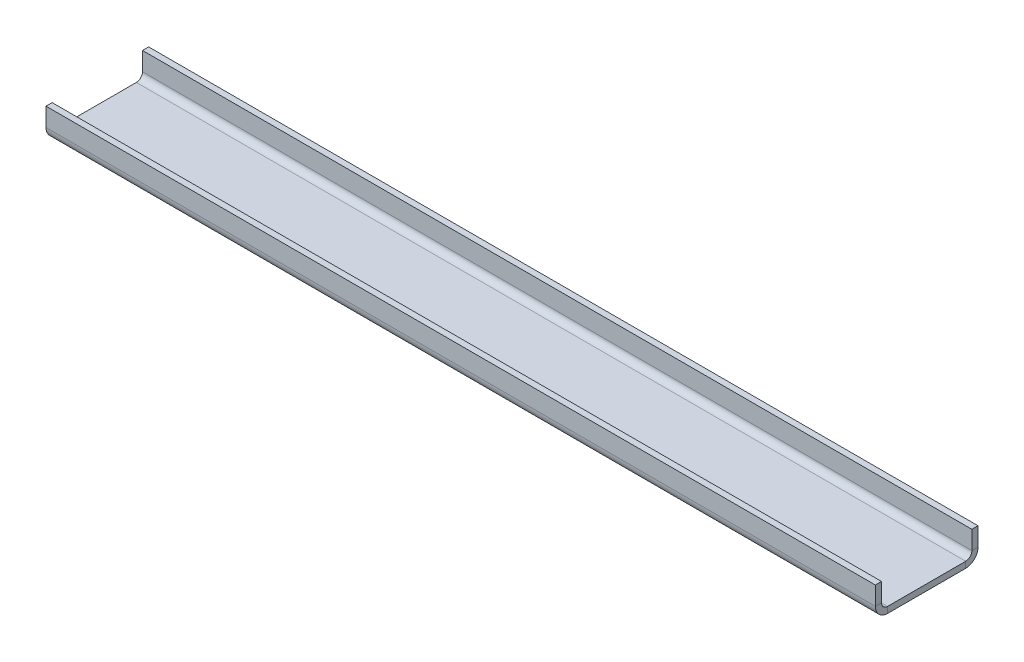
ISO-10303-21;
HEADER;
FILE_DESCRIPTION(('STEP AP214'),'2;1');
FILE_NAME('part.step','',(''),(''),'','','');
FILE_SCHEMA(('AUTOMOTIVE_DESIGN { 1 0 10303 214 1 1 1 1 }'));
ENDSEC;
DATA;
#1=APPLICATION_CONTEXT('core data for automotive mechanical design processes');
#2=APPLICATION_PROTOCOL_DEFINITION('international standard','automotive_design',2000,#1);
#3=PRODUCT_CONTEXT('',#1,'mechanical');
#4=PRODUCT('Part','Part','',(#3));
#5=PRODUCT_RELATED_PRODUCT_CATEGORY('part','',(#4));
#6=PRODUCT_DEFINITION_FORMATION('','',#4);
#7=PRODUCT_DEFINITION_CONTEXT('part definition',#1,'design');
#8=PRODUCT_DEFINITION('design','',#6,#7);
#9=PRODUCT_DEFINITION_SHAPE('','',#8);
#10=(LENGTH_UNIT() NAMED_UNIT(*) SI_UNIT(.MILLI.,.METRE.));
#11=(NAMED_UNIT(*) PLANE_ANGLE_UNIT() SI_UNIT($,.RADIAN.));
#12=(NAMED_UNIT(*) SI_UNIT($,.STERADIAN.) SOLID_ANGLE_UNIT());
#13=UNCERTAINTY_MEASURE_WITH_UNIT(LENGTH_MEASURE(1.E-05),#10,'distance_accuracy_value','');
#14=(GEOMETRIC_REPRESENTATION_CONTEXT(3) GLOBAL_UNCERTAINTY_ASSIGNED_CONTEXT((#13)) GLOBAL_UNIT_ASSIGNED_CONTEXT((#10,
#11,#12)) REPRESENTATION_CONTEXT('',''));
#15=CARTESIAN_POINT('',(0.,0.,0.));
#16=DIRECTION('',(0.,0.,1.));
#17=DIRECTION('',(1.,0.,0.));
#18=AXIS2_PLACEMENT_3D('',#15,#16,#17);
#19=CARTESIAN_POINT('',(0.,-3.,0.));
#20=DIRECTION('',(0.,-1.,0.));
#21=DIRECTION('',(0.,0.,-1.));
#22=AXIS2_PLACEMENT_3D('',#19,#20,#21);
#23=PLANE('',#22);
#24=DIRECTION('',(0.,0.,1.));
#25=VECTOR('',#24,1.);
#26=CARTESIAN_POINT('',(0.,-3.,0.));
#27=LINE('',#26,#25);
#28=CARTESIAN_POINT('',(0.,-3.00000000000001,-44.));
#29=VERTEX_POINT('',#28);
#30=CARTESIAN_POINT('',(0.,-3.,-6.));
#31=VERTEX_POINT('',#30);
#32=EDGE_CURVE('E84',#29,#31,#27,.T.);
#33=ORIENTED_EDGE('',*,*,#32,.F.);
#34=DIRECTION('',(-1.,0.,0.));
#35=VECTOR('',#34,1.);
#36=CARTESIAN_POINT('',(0.,-3.00000000000001,-44.));
#37=LINE('',#36,#35);
#38=CARTESIAN_POINT('',(404.,-3.,-44.));
#39=VERTEX_POINT('',#38);
#40=EDGE_CURVE('E207',#29,#39,#37,.F.);
#41=ORIENTED_EDGE('',*,*,#40,.T.);
#42=DIRECTION('',(0.,0.,-1.));
#43=VECTOR('',#42,1.);
#44=CARTESIAN_POINT('',(404.,-3.,0.));
#45=LINE('',#44,#43);
#46=CARTESIAN_POINT('',(404.,-3.00000000000001,-6.));
#47=VERTEX_POINT('',#46);
#48=EDGE_CURVE('E13',#47,#39,#45,.T.);
#49=ORIENTED_EDGE('',*,*,#48,.F.);
#50=DIRECTION('',(1.,0.,0.));
#51=VECTOR('',#50,1.);
#52=CARTESIAN_POINT('',(404.,-3.00000000000001,-6.));
#53=LINE('',#52,#51);
#54=EDGE_CURVE('E258',#47,#31,#53,.F.);
#55=ORIENTED_EDGE('',*,*,#54,.T.);
#56=EDGE_LOOP('',(#33,#41,#49,#55));
#57=FACE_BOUND('',#56,.T.);
#58=ADVANCED_FACE('F75',(#57),#23,.T.);
#59=CARTESIAN_POINT('',(0.,0.,0.));
#60=DIRECTION('',(0.,-1.,0.));
#61=DIRECTION('',(0.,0.,-1.));
#62=AXIS2_PLACEMENT_3D('',#59,#60,#61);
#63=PLANE('',#62);
#64=DIRECTION('',(-1.,0.,0.));
#65=VECTOR('',#64,1.);
#66=CARTESIAN_POINT('',(0.,0.,-44.));
#67=LINE('',#66,#65);
#68=CARTESIAN_POINT('',(0.,0.,-44.));
#69=VERTEX_POINT('',#68);
#70=CARTESIAN_POINT('',(404.,0.,-44.));
#71=VERTEX_POINT('',#70);
#72=EDGE_CURVE('E218',#69,#71,#67,.F.);
#73=ORIENTED_EDGE('',*,*,#72,.F.);
#74=DIRECTION('',(0.,0.,1.));
#75=VECTOR('',#74,1.);
#76=CARTESIAN_POINT('',(0.,0.,0.));
#77=LINE('',#76,#75);
#78=CARTESIAN_POINT('',(0.,0.,-6.));
#79=VERTEX_POINT('',#78);
#80=EDGE_CURVE('E275',#69,#79,#77,.T.);
#81=ORIENTED_EDGE('',*,*,#80,.T.);
#82=DIRECTION('',(1.,0.,0.));
#83=VECTOR('',#82,1.);
#84=CARTESIAN_POINT('',(404.,0.,-6.));
#85=LINE('',#84,#83);
#86=CARTESIAN_POINT('',(404.,0.,-6.));
#87=VERTEX_POINT('',#86);
#88=EDGE_CURVE('E269',#87,#79,#85,.F.);
#89=ORIENTED_EDGE('',*,*,#88,.F.);
#90=DIRECTION('',(0.,0.,-1.));
#91=VECTOR('',#90,1.);
#92=CARTESIAN_POINT('',(404.,0.,0.));
#93=LINE('',#92,#91);
#94=EDGE_CURVE('E79',#87,#71,#93,.T.);
#95=ORIENTED_EDGE('',*,*,#94,.T.);
#96=EDGE_LOOP('',(#73,#81,#89,#95));
#97=FACE_BOUND('',#96,.T.);
#98=ADVANCED_FACE('F287',(#97),#63,.F.);
#99=CARTESIAN_POINT('',(0.,-3.,0.));
#100=DIRECTION('',(-1.,0.,0.));
#101=DIRECTION('',(0.,0.,1.));
#102=AXIS2_PLACEMENT_3D('',#99,#100,#101);
#103=PLANE('',#102);
#104=ORIENTED_EDGE('',*,*,#80,.F.);
#105=DIRECTION('',(0.,-1.,0.));
#106=VECTOR('',#105,1.);
#107=CARTESIAN_POINT('',(0.,0.,-44.));
#108=LINE('',#107,#106);
#109=EDGE_CURVE('E212',#69,#29,#108,.T.);
#110=ORIENTED_EDGE('',*,*,#109,.T.);
#111=ORIENTED_EDGE('',*,*,#32,.T.);
#112=DIRECTION('',(0.,-1.,0.));
#113=VECTOR('',#112,1.);
#114=CARTESIAN_POINT('',(0.,0.,-6.));
#115=LINE('',#114,#113);
#116=EDGE_CURVE('E273',#79,#31,#115,.T.);
#117=ORIENTED_EDGE('',*,*,#116,.F.);
#118=EDGE_LOOP('',(#104,#110,#111,#117));
#119=FACE_BOUND('',#118,.T.);
#120=ADVANCED_FACE('F77',(#119),#103,.T.);
#121=CARTESIAN_POINT('',(404.,-3.,0.));
#122=DIRECTION('',(1.,0.,0.));
#123=DIRECTION('',(0.,0.,-1.));
#124=AXIS2_PLACEMENT_3D('',#121,#122,#123);
#125=PLANE('',#124);
#126=DIRECTION('',(0.,-1.,0.));
#127=VECTOR('',#126,1.);
#128=CARTESIAN_POINT('',(404.,0.,-44.));
#129=LINE('',#128,#127);
#130=EDGE_CURVE('E223',#71,#39,#129,.T.);
#131=ORIENTED_EDGE('',*,*,#130,.F.);
#132=ORIENTED_EDGE('',*,*,#94,.F.);
#133=DIRECTION('',(0.,-1.,0.));
#134=VECTOR('',#133,1.);
#135=CARTESIAN_POINT('',(404.,0.,-6.));
#136=LINE('',#135,#134);
#137=EDGE_CURVE('E263',#87,#47,#136,.T.);
#138=ORIENTED_EDGE('',*,*,#137,.T.);
#139=ORIENTED_EDGE('',*,*,#48,.T.);
#140=EDGE_LOOP('',(#131,#132,#138,#139));
#141=FACE_BOUND('',#140,.T.);
#142=ADVANCED_FACE('F290',(#141),#125,.T.);
#143=CARTESIAN_POINT('',(0.,2.99999999999999,-6.));
#144=DIRECTION('',(-1.,0.,0.));
#145=DIRECTION('',(0.,0.,1.));
#146=AXIS2_PLACEMENT_3D('',#143,#144,#145);
#147=PLANE('',#146);
#148=DIRECTION('',(0.,0.,-1.));
#149=VECTOR('',#148,1.);
#150=CARTESIAN_POINT('',(0.,2.99999999999999,0.));
#151=LINE('',#150,#149);
#152=CARTESIAN_POINT('',(0.,2.99999999999999,-3.));
#153=VERTEX_POINT('',#152);
#154=CARTESIAN_POINT('',(0.,2.99999999999999,0.));
#155=VERTEX_POINT('',#154);
#156=EDGE_CURVE('E225',#153,#155,#151,.F.);
#157=ORIENTED_EDGE('',*,*,#156,.F.);
#158=CARTESIAN_POINT('',(0.,2.99999999999999,-6.));
#159=DIRECTION('',(1.,0.,0.));
#160=DIRECTION('',(0.,0.,-1.));
#161=AXIS2_PLACEMENT_3D('',#158,#159,#160);
#162=CIRCLE('',#161,3.);
#163=EDGE_CURVE('E266',#79,#153,#162,.F.);
#164=ORIENTED_EDGE('',*,*,#163,.F.);
#165=ORIENTED_EDGE('',*,*,#116,.T.);
#166=CARTESIAN_POINT('',(0.,2.99999999999999,-6.));
#167=DIRECTION('',(1.,0.,0.));
#168=DIRECTION('',(0.,0.,-1.));
#169=AXIS2_PLACEMENT_3D('',#166,#167,#168);
#170=CIRCLE('',#169,6.);
#171=EDGE_CURVE('E92',#31,#155,#170,.F.);
#172=ORIENTED_EDGE('',*,*,#171,.T.);
#173=EDGE_LOOP('',(#157,#164,#165,#172));
#174=FACE_BOUND('',#173,.T.);
#175=ADVANCED_FACE('F305',(#174),#147,.T.);
#176=CARTESIAN_POINT('',(404.,2.99999999999999,-6.));
#177=DIRECTION('',(-1.,0.,0.));
#178=DIRECTION('',(0.,0.,1.));
#179=AXIS2_PLACEMENT_3D('',#176,#177,#178);
#180=PLANE('',#179);
#181=CARTESIAN_POINT('',(404.,2.99999999999999,-6.));
#182=DIRECTION('',(1.,0.,0.));
#183=DIRECTION('',(0.,0.,-1.));
#184=AXIS2_PLACEMENT_3D('',#181,#182,#183);
#185=CIRCLE('',#184,3.);
#186=CARTESIAN_POINT('',(404.,2.99999999999999,-3.));
#187=VERTEX_POINT('',#186);
#188=EDGE_CURVE('E231',#187,#87,#185,.T.);
#189=ORIENTED_EDGE('',*,*,#188,.F.);
#190=DIRECTION('',(0.,0.,-1.));
#191=VECTOR('',#190,1.);
#192=CARTESIAN_POINT('',(404.,2.99999999999999,-2.99999999999999));
#193=LINE('',#192,#191);
#194=CARTESIAN_POINT('',(404.,2.99999999999999,0.));
#195=VERTEX_POINT('',#194);
#196=EDGE_CURVE('E251',#187,#195,#193,.F.);
#197=ORIENTED_EDGE('',*,*,#196,.T.);
#198=CARTESIAN_POINT('',(404.,2.99999999999999,-6.));
#199=DIRECTION('',(1.,0.,0.));
#200=DIRECTION('',(0.,0.,-1.));
#201=AXIS2_PLACEMENT_3D('',#198,#199,#200);
#202=CIRCLE('',#201,6.);
#203=EDGE_CURVE('E261',#195,#47,#202,.T.);
#204=ORIENTED_EDGE('',*,*,#203,.T.);
#205=ORIENTED_EDGE('',*,*,#137,.F.);
#206=EDGE_LOOP('',(#189,#197,#204,#205));
#207=FACE_BOUND('',#206,.T.);
#208=ADVANCED_FACE('F329',(#207),#180,.F.);
#209=CARTESIAN_POINT('',(404.,2.99999999999999,-6.));
#210=DIRECTION('',(1.,0.,0.));
#211=DIRECTION('',(0.,0.,1.));
#212=AXIS2_PLACEMENT_3D('',#209,#210,#211);
#213=CYLINDRICAL_SURFACE('',#212,6.);
#214=ORIENTED_EDGE('',*,*,#54,.F.);
#215=ORIENTED_EDGE('',*,*,#203,.F.);
#216=DIRECTION('',(1.,0.,0.));
#217=VECTOR('',#216,1.);
#218=CARTESIAN_POINT('',(0.,2.99999999999999,0.));
#219=LINE('',#218,#217);
#220=EDGE_CURVE('E249',#195,#155,#219,.F.);
#221=ORIENTED_EDGE('',*,*,#220,.T.);
#222=ORIENTED_EDGE('',*,*,#171,.F.);
#223=EDGE_LOOP('',(#214,#215,#221,#222));
#224=FACE_BOUND('',#223,.T.);
#225=ADVANCED_FACE('F332',(#224),#213,.T.);
#226=CARTESIAN_POINT('',(404.,2.99999999999999,-6.));
#227=DIRECTION('',(1.,0.,0.));
#228=DIRECTION('',(0.,0.,1.));
#229=AXIS2_PLACEMENT_3D('',#226,#227,#228);
#230=CYLINDRICAL_SURFACE('',#229,3.);
#231=ORIENTED_EDGE('',*,*,#88,.T.);
#232=ORIENTED_EDGE('',*,*,#163,.T.);
#233=DIRECTION('',(1.,0.,0.));
#234=VECTOR('',#233,1.);
#235=CARTESIAN_POINT('',(0.,2.99999999999999,-3.));
#236=LINE('',#235,#234);
#237=EDGE_CURVE('E254',#153,#187,#236,.T.);
#238=ORIENTED_EDGE('',*,*,#237,.T.);
#239=ORIENTED_EDGE('',*,*,#188,.T.);
#240=EDGE_LOOP('',(#231,#232,#238,#239));
#241=FACE_BOUND('',#240,.T.);
#242=ADVANCED_FACE('F308',(#241),#230,.F.);
#243=CARTESIAN_POINT('',(0.,0.,0.));
#244=DIRECTION('',(1.,0.,0.));
#245=DIRECTION('',(0.,0.,-1.));
#246=AXIS2_PLACEMENT_3D('',#243,#244,#245);
#247=PLANE('',#246);
#248=ORIENTED_EDGE('',*,*,#156,.T.);
#249=DIRECTION('',(0.,-1.,0.));
#250=VECTOR('',#249,1.);
#251=CARTESIAN_POINT('',(0.,0.,0.));
#252=LINE('',#251,#250);
#253=CARTESIAN_POINT('',(0.,12.,0.));
#254=VERTEX_POINT('',#253);
#255=EDGE_CURVE('E239',#254,#155,#252,.T.);
#256=ORIENTED_EDGE('',*,*,#255,.F.);
#257=DIRECTION('',(0.,0.,-1.));
#258=VECTOR('',#257,1.);
#259=CARTESIAN_POINT('',(0.,12.,0.));
#260=LINE('',#259,#258);
#261=CARTESIAN_POINT('',(0.,12.,-3.));
#262=VERTEX_POINT('',#261);
#263=EDGE_CURVE('E232',#254,#262,#260,.T.);
#264=ORIENTED_EDGE('',*,*,#263,.T.);
#265=DIRECTION('',(0.,1.,0.));
#266=VECTOR('',#265,1.);
#267=CARTESIAN_POINT('',(0.,0.,-3.));
#268=LINE('',#267,#266);
#269=EDGE_CURVE('E246',#262,#153,#268,.F.);
#270=ORIENTED_EDGE('',*,*,#269,.T.);
#271=EDGE_LOOP('',(#248,#256,#264,#270));
#272=FACE_BOUND('',#271,.T.);
#273=ADVANCED_FACE('F316',(#272),#247,.F.);
#274=CARTESIAN_POINT('',(404.,12.,0.));
#275=DIRECTION('',(-1.,0.,0.));
#276=DIRECTION('',(0.,0.,1.));
#277=AXIS2_PLACEMENT_3D('',#274,#275,#276);
#278=PLANE('',#277);
#279=ORIENTED_EDGE('',*,*,#196,.F.);
#280=DIRECTION('',(0.,-1.,0.));
#281=VECTOR('',#280,1.);
#282=CARTESIAN_POINT('',(404.,12.,-3.));
#283=LINE('',#282,#281);
#284=CARTESIAN_POINT('',(404.,12.,-3.));
#285=VERTEX_POINT('',#284);
#286=EDGE_CURVE('E244',#187,#285,#283,.F.);
#287=ORIENTED_EDGE('',*,*,#286,.T.);
#288=DIRECTION('',(0.,0.,-1.));
#289=VECTOR('',#288,1.);
#290=CARTESIAN_POINT('',(404.,12.,0.));
#291=LINE('',#290,#289);
#292=CARTESIAN_POINT('',(404.,12.,0.));
#293=VERTEX_POINT('',#292);
#294=EDGE_CURVE('E228',#293,#285,#291,.T.);
#295=ORIENTED_EDGE('',*,*,#294,.F.);
#296=DIRECTION('',(0.,1.,0.));
#297=VECTOR('',#296,1.);
#298=CARTESIAN_POINT('',(404.,0.,0.));
#299=LINE('',#298,#297);
#300=EDGE_CURVE('E237',#195,#293,#299,.T.);
#301=ORIENTED_EDGE('',*,*,#300,.F.);
#302=EDGE_LOOP('',(#279,#287,#295,#301));
#303=FACE_BOUND('',#302,.T.);
#304=ADVANCED_FACE('F326',(#303),#278,.F.);
#305=CARTESIAN_POINT('',(0.,0.,0.));
#306=DIRECTION('',(0.,0.,-1.));
#307=DIRECTION('',(-1.,0.,0.));
#308=AXIS2_PLACEMENT_3D('',#305,#306,#307);
#309=PLANE('',#308);
#310=ORIENTED_EDGE('',*,*,#220,.F.);
#311=ORIENTED_EDGE('',*,*,#300,.T.);
#312=DIRECTION('',(-1.,0.,0.));
#313=VECTOR('',#312,1.);
#314=CARTESIAN_POINT('',(0.,12.,0.));
#315=LINE('',#314,#313);
#316=EDGE_CURVE('E235',#293,#254,#315,.T.);
#317=ORIENTED_EDGE('',*,*,#316,.T.);
#318=ORIENTED_EDGE('',*,*,#255,.T.);
#319=EDGE_LOOP('',(#310,#311,#317,#318));
#320=FACE_BOUND('',#319,.T.);
#321=ADVANCED_FACE('F331',(#320),#309,.F.);
#322=CARTESIAN_POINT('',(0.,0.,-3.));
#323=DIRECTION('',(0.,0.,-1.));
#324=DIRECTION('',(-1.,0.,0.));
#325=AXIS2_PLACEMENT_3D('',#322,#323,#324);
#326=PLANE('',#325);
#327=ORIENTED_EDGE('',*,*,#286,.F.);
#328=ORIENTED_EDGE('',*,*,#237,.F.);
#329=ORIENTED_EDGE('',*,*,#269,.F.);
#330=DIRECTION('',(1.,0.,0.));
#331=VECTOR('',#330,1.);
#332=CARTESIAN_POINT('',(0.,12.,-3.));
#333=LINE('',#332,#331);
#334=EDGE_CURVE('E242',#285,#262,#333,.F.);
#335=ORIENTED_EDGE('',*,*,#334,.F.);
#336=EDGE_LOOP('',(#327,#328,#329,#335));
#337=FACE_BOUND('',#336,.T.);
#338=ADVANCED_FACE('F313',(#337),#326,.T.);
#339=CARTESIAN_POINT('',(0.,12.,0.));
#340=DIRECTION('',(0.,-1.,0.));
#341=DIRECTION('',(0.,0.,-1.));
#342=AXIS2_PLACEMENT_3D('',#339,#340,#341);
#343=PLANE('',#342);
#344=ORIENTED_EDGE('',*,*,#334,.T.);
#345=ORIENTED_EDGE('',*,*,#263,.F.);
#346=ORIENTED_EDGE('',*,*,#316,.F.);
#347=ORIENTED_EDGE('',*,*,#294,.T.);
#348=EDGE_LOOP('',(#344,#345,#346,#347));
#349=FACE_BOUND('',#348,.T.);
#350=ADVANCED_FACE('F321',(#349),#343,.F.);
#351=CARTESIAN_POINT('',(404.,2.99999999999996,-44.));
#352=DIRECTION('',(1.,0.,0.));
#353=DIRECTION('',(0.,1.,0.));
#354=AXIS2_PLACEMENT_3D('',#351,#352,#353);
#355=PLANE('',#354);
#356=DIRECTION('',(0.,0.,1.));
#357=VECTOR('',#356,1.);
#358=CARTESIAN_POINT('',(404.,3.00000000000001,-50.));
#359=LINE('',#358,#357);
#360=CARTESIAN_POINT('',(404.,2.99999999999995,-47.));
#361=VERTEX_POINT('',#360);
#362=CARTESIAN_POINT('',(404.,2.99999999999994,-50.));
#363=VERTEX_POINT('',#362);
#364=EDGE_CURVE('E190',#361,#363,#359,.F.);
#365=ORIENTED_EDGE('',*,*,#364,.F.);
#366=CARTESIAN_POINT('',(404.,2.99999999999996,-44.));
#367=DIRECTION('',(-1.,0.,0.));
#368=DIRECTION('',(0.,-1.,0.));
#369=AXIS2_PLACEMENT_3D('',#366,#367,#368);
#370=CIRCLE('',#369,3.);
#371=EDGE_CURVE('E215',#71,#361,#370,.F.);
#372=ORIENTED_EDGE('',*,*,#371,.F.);
#373=ORIENTED_EDGE('',*,*,#130,.T.);
#374=CARTESIAN_POINT('',(404.,2.99999999999996,-44.));
#375=DIRECTION('',(-1.,0.,0.));
#376=DIRECTION('',(0.,-1.,0.));
#377=AXIS2_PLACEMENT_3D('',#374,#375,#376);
#378=CIRCLE('',#377,6.);
#379=EDGE_CURVE('E100',#39,#363,#378,.F.);
#380=ORIENTED_EDGE('',*,*,#379,.T.);
#381=EDGE_LOOP('',(#365,#372,#373,#380));
#382=FACE_BOUND('',#381,.T.);
#383=ADVANCED_FACE('F294',(#382),#355,.T.);
#384=CARTESIAN_POINT('',(0.,2.99999999999999,-44.));
#385=DIRECTION('',(1.,0.,0.));
#386=DIRECTION('',(0.,1.,0.));
#387=AXIS2_PLACEMENT_3D('',#384,#385,#386);
#388=PLANE('',#387);
#389=CARTESIAN_POINT('',(0.,2.99999999999999,-44.));
#390=DIRECTION('',(-1.,0.,0.));
#391=DIRECTION('',(0.,-1.,0.));
#392=AXIS2_PLACEMENT_3D('',#389,#390,#391);
#393=CIRCLE('',#392,3.);
#394=CARTESIAN_POINT('',(0.,2.99999999999998,-47.));
#395=VERTEX_POINT('',#394);
#396=EDGE_CURVE('E220',#395,#69,#393,.T.);
#397=ORIENTED_EDGE('',*,*,#396,.F.);
#398=DIRECTION('',(0.,0.,1.));
#399=VECTOR('',#398,1.);
#400=CARTESIAN_POINT('',(0.,3.,-47.));
#401=LINE('',#400,#399);
#402=CARTESIAN_POINT('',(0.,3.00000000000002,-50.));
#403=VERTEX_POINT('',#402);
#404=EDGE_CURVE('E201',#395,#403,#401,.F.);
#405=ORIENTED_EDGE('',*,*,#404,.T.);
#406=CARTESIAN_POINT('',(0.,2.99999999999999,-44.));
#407=DIRECTION('',(-1.,0.,0.));
#408=DIRECTION('',(0.,-1.,0.));
#409=AXIS2_PLACEMENT_3D('',#406,#407,#408);
#410=CIRCLE('',#409,6.);
#411=EDGE_CURVE('E210',#403,#29,#410,.T.);
#412=ORIENTED_EDGE('',*,*,#411,.T.);
#413=ORIENTED_EDGE('',*,*,#109,.F.);
#414=EDGE_LOOP('',(#397,#405,#412,#413));
#415=FACE_BOUND('',#414,.T.);
#416=ADVANCED_FACE('F300',(#415),#388,.F.);
#417=CARTESIAN_POINT('',(0.,2.99999999999999,-44.));
#418=DIRECTION('',(-1.,0.,0.));
#419=DIRECTION('',(0.,0.,-1.));
#420=AXIS2_PLACEMENT_3D('',#417,#418,#419);
#421=CYLINDRICAL_SURFACE('',#420,6.);
#422=ORIENTED_EDGE('',*,*,#40,.F.);
#423=ORIENTED_EDGE('',*,*,#411,.F.);
#424=DIRECTION('',(-1.,0.,0.));
#425=VECTOR('',#424,1.);
#426=CARTESIAN_POINT('',(404.,3.00000000000001,-50.));
#427=LINE('',#426,#425);
#428=EDGE_CURVE('E199',#403,#363,#427,.F.);
#429=ORIENTED_EDGE('',*,*,#428,.T.);
#430=ORIENTED_EDGE('',*,*,#379,.F.);
#431=EDGE_LOOP('',(#422,#423,#429,#430));
#432=FACE_BOUND('',#431,.T.);
#433=ADVANCED_FACE('F297',(#432),#421,.T.);
#434=CARTESIAN_POINT('',(0.,2.99999999999999,-44.));
#435=DIRECTION('',(-1.,0.,0.));
#436=DIRECTION('',(0.,0.,-1.));
#437=AXIS2_PLACEMENT_3D('',#434,#435,#436);
#438=CYLINDRICAL_SURFACE('',#437,3.);
#439=ORIENTED_EDGE('',*,*,#72,.T.);
#440=ORIENTED_EDGE('',*,*,#371,.T.);
#441=DIRECTION('',(-1.,0.,0.));
#442=VECTOR('',#441,1.);
#443=CARTESIAN_POINT('',(404.,2.99999999999999,-47.));
#444=LINE('',#443,#442);
#445=EDGE_CURVE('E204',#361,#395,#444,.T.);
#446=ORIENTED_EDGE('',*,*,#445,.T.);
#447=ORIENTED_EDGE('',*,*,#396,.T.);
#448=EDGE_LOOP('',(#439,#440,#446,#447));
#449=FACE_BOUND('',#448,.T.);
#450=ADVANCED_FACE('F468',(#449),#438,.F.);
#451=CARTESIAN_POINT('',(404.,0.,-50.));
#452=DIRECTION('',(-1.,0.,0.));
#453=DIRECTION('',(0.,0.,1.));
#454=AXIS2_PLACEMENT_3D('',#451,#452,#453);
#455=PLANE('',#454);
#456=ORIENTED_EDGE('',*,*,#364,.T.);
#457=DIRECTION('',(0.,-1.,0.));
#458=VECTOR('',#457,1.);
#459=CARTESIAN_POINT('',(404.,-1.83946797681009E-13,-50.));
#460=LINE('',#459,#458);
#461=CARTESIAN_POINT('',(404.,12.,-50.));
#462=VERTEX_POINT('',#461);
#463=EDGE_CURVE('E171',#462,#363,#460,.T.);
#464=ORIENTED_EDGE('',*,*,#463,.F.);
#465=DIRECTION('',(0.,0.,1.));
#466=VECTOR('',#465,1.);
#467=CARTESIAN_POINT('',(404.,12.,-50.));
#468=LINE('',#467,#466);
#469=CARTESIAN_POINT('',(404.,12.,-47.));
#470=VERTEX_POINT('',#469);
#471=EDGE_CURVE('E177',#462,#470,#468,.T.);
#472=ORIENTED_EDGE('',*,*,#471,.T.);
#473=DIRECTION('',(0.,1.,0.));
#474=VECTOR('',#473,1.);
#475=CARTESIAN_POINT('',(404.,0.,-47.));
#476=LINE('',#475,#474);
#477=EDGE_CURVE('E197',#470,#361,#476,.F.);
#478=ORIENTED_EDGE('',*,*,#477,.T.);
#479=EDGE_LOOP('',(#456,#464,#472,#478));
#480=FACE_BOUND('',#479,.T.);
#481=ADVANCED_FACE('F189',(#480),#455,.F.);
#482=CARTESIAN_POINT('',(0.,12.,-50.));
#483=DIRECTION('',(1.,0.,0.));
#484=DIRECTION('',(0.,0.,-1.));
#485=AXIS2_PLACEMENT_3D('',#482,#483,#484);
#486=PLANE('',#485);
#487=ORIENTED_EDGE('',*,*,#404,.F.);
#488=DIRECTION('',(0.,-1.,0.));
#489=VECTOR('',#488,1.);
#490=CARTESIAN_POINT('',(0.,12.,-47.));
#491=LINE('',#490,#489);
#492=CARTESIAN_POINT('',(0.,12.,-47.));
#493=VERTEX_POINT('',#492);
#494=EDGE_CURVE('E193',#395,#493,#491,.F.);
#495=ORIENTED_EDGE('',*,*,#494,.T.);
#496=DIRECTION('',(0.,0.,1.));
#497=VECTOR('',#496,1.);
#498=CARTESIAN_POINT('',(0.,12.,-50.));
#499=LINE('',#498,#497);
#500=CARTESIAN_POINT('',(0.,12.,-50.));
#501=VERTEX_POINT('',#500);
#502=EDGE_CURVE('E186',#501,#493,#499,.T.);
#503=ORIENTED_EDGE('',*,*,#502,.F.);
#504=DIRECTION('',(0.,1.,0.));
#505=VECTOR('',#504,1.);
#506=CARTESIAN_POINT('',(0.,-1.83946797681009E-13,-50.));
#507=LINE('',#506,#505);
#508=EDGE_CURVE('E173',#403,#501,#507,.T.);
#509=ORIENTED_EDGE('',*,*,#508,.F.);
#510=EDGE_LOOP('',(#487,#495,#503,#509));
#511=FACE_BOUND('',#510,.T.);
#512=ADVANCED_FACE('F488',(#511),#486,.F.);
#513=CARTESIAN_POINT('',(0.,-1.83946797681009E-13,-50.));
#514=DIRECTION('',(0.,0.,1.));
#515=DIRECTION('',(0.,-1.,0.));
#516=AXIS2_PLACEMENT_3D('',#513,#514,#515);
#517=PLANE('',#516);
#518=ORIENTED_EDGE('',*,*,#428,.F.);
#519=ORIENTED_EDGE('',*,*,#508,.T.);
#520=DIRECTION('',(1.,0.,0.));
#521=VECTOR('',#520,1.);
#522=CARTESIAN_POINT('',(0.,12.,-50.));
#523=LINE('',#522,#521);
#524=EDGE_CURVE('E166',#501,#462,#523,.T.);
#525=ORIENTED_EDGE('',*,*,#524,.T.);
#526=ORIENTED_EDGE('',*,*,#463,.T.);
#527=EDGE_LOOP('',(#518,#519,#525,#526));
#528=FACE_BOUND('',#527,.T.);
#529=ADVANCED_FACE('F169',(#528),#517,.F.);
#530=CARTESIAN_POINT('',(0.,-1.73472347597681E-13,-47.));
#531=DIRECTION('',(0.,0.,1.));
#532=DIRECTION('',(0.,-1.,0.));
#533=AXIS2_PLACEMENT_3D('',#530,#531,#532);
#534=PLANE('',#533);
#535=ORIENTED_EDGE('',*,*,#494,.F.);
#536=ORIENTED_EDGE('',*,*,#445,.F.);
#537=ORIENTED_EDGE('',*,*,#477,.F.);
#538=DIRECTION('',(-1.,0.,0.));
#539=VECTOR('',#538,1.);
#540=CARTESIAN_POINT('',(404.,12.,-47.));
#541=LINE('',#540,#539);
#542=EDGE_CURVE('E182',#493,#470,#541,.F.);
#543=ORIENTED_EDGE('',*,*,#542,.F.);
#544=EDGE_LOOP('',(#535,#536,#537,#543));
#545=FACE_BOUND('',#544,.T.);
#546=ADVANCED_FACE('F508',(#545),#534,.T.);
#547=CARTESIAN_POINT('',(404.,12.,-50.));
#548=DIRECTION('',(0.,-1.,0.));
#549=DIRECTION('',(0.,0.,-1.));
#550=AXIS2_PLACEMENT_3D('',#547,#548,#549);
#551=PLANE('',#550);
#552=ORIENTED_EDGE('',*,*,#542,.T.);
#553=ORIENTED_EDGE('',*,*,#471,.F.);
#554=ORIENTED_EDGE('',*,*,#524,.F.);
#555=ORIENTED_EDGE('',*,*,#502,.T.);
#556=EDGE_LOOP('',(#552,#553,#554,#555));
#557=FACE_BOUND('',#556,.T.);
#558=ADVANCED_FACE('F180',(#557),#551,.F.);
#559=CLOSED_SHELL('',(#58,#98,#120,#142,#175,#208,#225,#242,#273,#304,#321,#338,#350,#383,#416,
#433,#450,#481,#512,#529,#546,#558));
#560=MANIFOLD_SOLID_BREP('B2',#559);
#561=ADVANCED_BREP_SHAPE_REPRESENTATION('',(#18,#560),#14);
#562=SHAPE_DEFINITION_REPRESENTATION(#9,#561);
ENDSEC;
END-ISO-10303-21;
